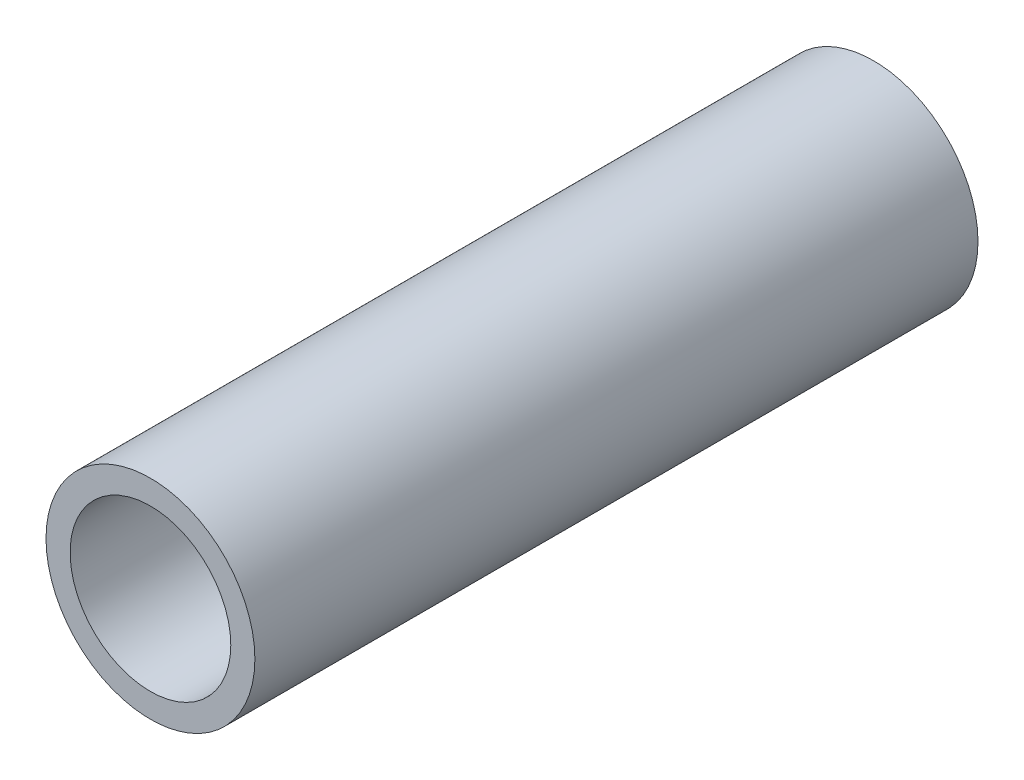
ISO-10303-21;
HEADER;
FILE_DESCRIPTION(('STEP AP214'),'2;1');
FILE_NAME('part.step','',(''),(''),'','','');
FILE_SCHEMA(('AUTOMOTIVE_DESIGN { 1 0 10303 214 1 1 1 1 }'));
ENDSEC;
DATA;
#1=APPLICATION_CONTEXT('core data for automotive mechanical design processes');
#2=APPLICATION_PROTOCOL_DEFINITION('international standard','automotive_design',2000,#1);
#3=PRODUCT_CONTEXT('',#1,'mechanical');
#4=PRODUCT('Part','Part','',(#3));
#5=PRODUCT_RELATED_PRODUCT_CATEGORY('part','',(#4));
#6=PRODUCT_DEFINITION_FORMATION('','',#4);
#7=PRODUCT_DEFINITION_CONTEXT('part definition',#1,'design');
#8=PRODUCT_DEFINITION('design','',#6,#7);
#9=PRODUCT_DEFINITION_SHAPE('','',#8);
#10=(LENGTH_UNIT() NAMED_UNIT(*) SI_UNIT(.MILLI.,.METRE.));
#11=(NAMED_UNIT(*) PLANE_ANGLE_UNIT() SI_UNIT($,.RADIAN.));
#12=(NAMED_UNIT(*) SI_UNIT($,.STERADIAN.) SOLID_ANGLE_UNIT());
#13=UNCERTAINTY_MEASURE_WITH_UNIT(LENGTH_MEASURE(1.E-05),#10,'distance_accuracy_value','');
#14=(GEOMETRIC_REPRESENTATION_CONTEXT(3) GLOBAL_UNCERTAINTY_ASSIGNED_CONTEXT((#13)) GLOBAL_UNIT_ASSIGNED_CONTEXT((#10,
#11,#12)) REPRESENTATION_CONTEXT('',''));
#15=CARTESIAN_POINT('',(0.,0.,0.));
#16=DIRECTION('',(0.,0.,1.));
#17=DIRECTION('',(1.,0.,0.));
#18=AXIS2_PLACEMENT_3D('',#15,#16,#17);
#19=CARTESIAN_POINT('',(0.,0.,114.3));
#20=DIRECTION('',(0.,0.,1.));
#21=DIRECTION('',(1.,0.,0.));
#22=AXIS2_PLACEMENT_3D('',#19,#20,#21);
#23=PLANE('',#22);
#24=CARTESIAN_POINT('',(0.,0.,114.3));
#25=DIRECTION('',(0.,0.,1.));
#26=DIRECTION('',(1.,0.,0.));
#27=AXIS2_PLACEMENT_3D('',#24,#25,#26);
#28=CIRCLE('',#27,16.51);
#29=CARTESIAN_POINT('',(16.51,0.,114.3));
#30=VERTEX_POINT('',#29);
#31=EDGE_CURVE('E10',#30,#30,#28,.T.);
#32=ORIENTED_EDGE('',*,*,#31,.T.);
#33=EDGE_LOOP('',(#32));
#34=FACE_BOUND('',#33,.T.);
#35=CARTESIAN_POINT('',(0.,0.,114.3));
#36=DIRECTION('',(0.,0.,1.));
#37=DIRECTION('',(1.,0.,0.));
#38=AXIS2_PLACEMENT_3D('',#35,#36,#37);
#39=CIRCLE('',#38,12.7);
#40=CARTESIAN_POINT('',(12.7,0.,114.3));
#41=VERTEX_POINT('',#40);
#42=EDGE_CURVE('E50',#41,#41,#39,.T.);
#43=ORIENTED_EDGE('',*,*,#42,.F.);
#44=EDGE_LOOP('',(#43));
#45=FACE_BOUND('',#44,.T.);
#46=ADVANCED_FACE('F37',(#34,#45),#23,.T.);
#47=CARTESIAN_POINT('',(0.,0.,0.));
#48=DIRECTION('',(0.,0.,1.));
#49=DIRECTION('',(1.,0.,0.));
#50=AXIS2_PLACEMENT_3D('',#47,#48,#49);
#51=PLANE('',#50);
#52=CARTESIAN_POINT('',(0.,0.,0.));
#53=DIRECTION('',(0.,0.,1.));
#54=DIRECTION('',(1.,0.,0.));
#55=AXIS2_PLACEMENT_3D('',#52,#53,#54);
#56=CIRCLE('',#55,16.51);
#57=CARTESIAN_POINT('',(16.51,0.,0.));
#58=VERTEX_POINT('',#57);
#59=EDGE_CURVE('E41',#58,#58,#56,.T.);
#60=ORIENTED_EDGE('',*,*,#59,.F.);
#61=EDGE_LOOP('',(#60));
#62=FACE_BOUND('',#61,.T.);
#63=CARTESIAN_POINT('',(0.,0.,0.));
#64=DIRECTION('',(0.,0.,1.));
#65=DIRECTION('',(1.,0.,0.));
#66=AXIS2_PLACEMENT_3D('',#63,#64,#65);
#67=CIRCLE('',#66,12.7);
#68=CARTESIAN_POINT('',(12.7,0.,0.));
#69=VERTEX_POINT('',#68);
#70=EDGE_CURVE('E52',#69,#69,#67,.T.);
#71=ORIENTED_EDGE('',*,*,#70,.T.);
#72=EDGE_LOOP('',(#71));
#73=FACE_BOUND('',#72,.T.);
#74=ADVANCED_FACE('F64',(#62,#73),#51,.F.);
#75=CARTESIAN_POINT('',(0.,0.,114.3));
#76=DIRECTION('',(0.,0.,-1.));
#77=DIRECTION('',(-1.,0.,0.));
#78=AXIS2_PLACEMENT_3D('',#75,#76,#77);
#79=CYLINDRICAL_SURFACE('',#78,16.51);
#80=ORIENTED_EDGE('',*,*,#31,.F.);
#81=EDGE_LOOP('',(#80));
#82=FACE_BOUND('',#81,.T.);
#83=ORIENTED_EDGE('',*,*,#59,.T.);
#84=EDGE_LOOP('',(#83));
#85=FACE_BOUND('',#84,.T.);
#86=ADVANCED_FACE('F39',(#82,#85),#79,.T.);
#87=CARTESIAN_POINT('',(0.,0.,114.3));
#88=DIRECTION('',(0.,0.,-1.));
#89=DIRECTION('',(-1.,0.,0.));
#90=AXIS2_PLACEMENT_3D('',#87,#88,#89);
#91=CYLINDRICAL_SURFACE('',#90,12.7);
#92=ORIENTED_EDGE('',*,*,#42,.T.);
#93=EDGE_LOOP('',(#92));
#94=FACE_BOUND('',#93,.T.);
#95=ORIENTED_EDGE('',*,*,#70,.F.);
#96=EDGE_LOOP('',(#95));
#97=FACE_BOUND('',#96,.T.);
#98=ADVANCED_FACE('F60',(#94,#97),#91,.F.);
#99=CLOSED_SHELL('',(#46,#74,#86,#98));
#100=MANIFOLD_SOLID_BREP('B2',#99);
#101=ADVANCED_BREP_SHAPE_REPRESENTATION('',(#18,#100),#14);
#102=SHAPE_DEFINITION_REPRESENTATION(#9,#101);
ENDSEC;
END-ISO-10303-21;
